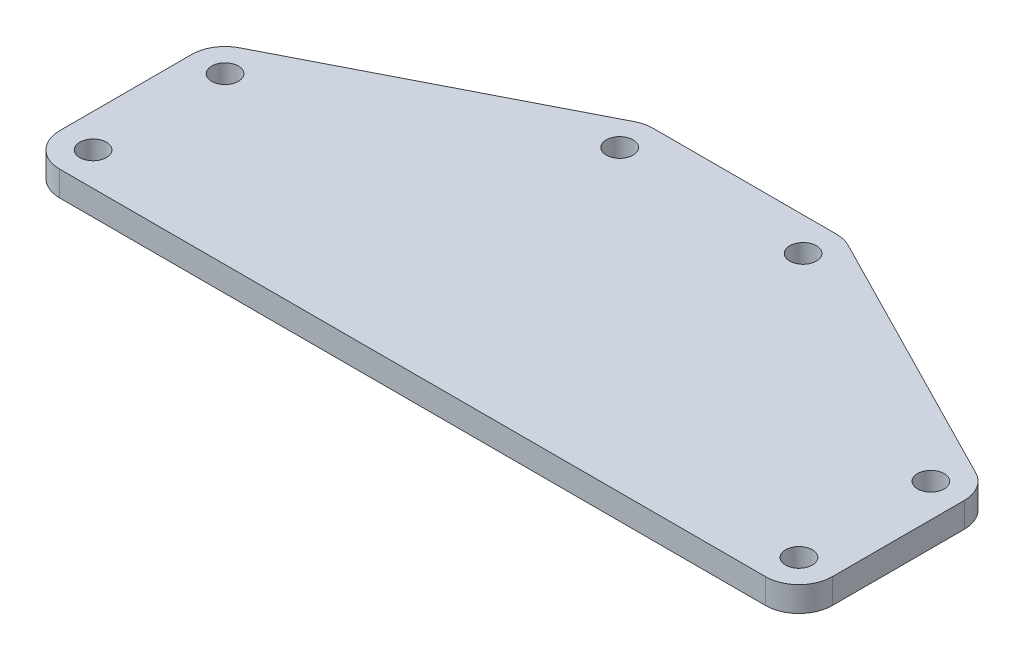
ISO-10303-21;
HEADER;
FILE_DESCRIPTION(('STEP AP214'),'2;1');
FILE_NAME('part.step','',(''),(''),'','','');
FILE_SCHEMA(('AUTOMOTIVE_DESIGN { 1 0 10303 214 1 1 1 1 }'));
ENDSEC;
DATA;
#1=APPLICATION_CONTEXT('core data for automotive mechanical design processes');
#2=APPLICATION_PROTOCOL_DEFINITION('international standard','automotive_design',2000,#1);
#3=PRODUCT_CONTEXT('',#1,'mechanical');
#4=PRODUCT('Part','Part','',(#3));
#5=PRODUCT_RELATED_PRODUCT_CATEGORY('part','',(#4));
#6=PRODUCT_DEFINITION_FORMATION('','',#4);
#7=PRODUCT_DEFINITION_CONTEXT('part definition',#1,'design');
#8=PRODUCT_DEFINITION('design','',#6,#7);
#9=PRODUCT_DEFINITION_SHAPE('','',#8);
#10=(LENGTH_UNIT() NAMED_UNIT(*) SI_UNIT(.MILLI.,.METRE.));
#11=(NAMED_UNIT(*) PLANE_ANGLE_UNIT() SI_UNIT($,.RADIAN.));
#12=(NAMED_UNIT(*) SI_UNIT($,.STERADIAN.) SOLID_ANGLE_UNIT());
#13=UNCERTAINTY_MEASURE_WITH_UNIT(LENGTH_MEASURE(1.E-05),#10,'distance_accuracy_value','');
#14=(GEOMETRIC_REPRESENTATION_CONTEXT(3) GLOBAL_UNCERTAINTY_ASSIGNED_CONTEXT((#13)) GLOBAL_UNIT_ASSIGNED_CONTEXT((#10,
#11,#12)) REPRESENTATION_CONTEXT('',''));
#15=CARTESIAN_POINT('',(0.,0.,0.));
#16=DIRECTION('',(0.,0.,1.));
#17=DIRECTION('',(1.,0.,0.));
#18=AXIS2_PLACEMENT_3D('',#15,#16,#17);
#19=CARTESIAN_POINT('',(-11.,3.,0.));
#20=DIRECTION('',(0.,1.,0.));
#21=DIRECTION('',(0.,0.,1.));
#22=AXIS2_PLACEMENT_3D('',#19,#20,#21);
#23=PLANE('',#22);
#24=CARTESIAN_POINT('',(-11.,3.,0.));
#25=DIRECTION('',(0.,1.,0.));
#26=DIRECTION('',(0.,0.,1.));
#27=AXIS2_PLACEMENT_3D('',#24,#25,#26);
#28=CIRCLE('',#27,1.6);
#29=CARTESIAN_POINT('',(-11.,3.,1.6));
#30=VERTEX_POINT('',#29);
#31=EDGE_CURVE('E468',#30,#30,#28,.T.);
#32=ORIENTED_EDGE('',*,*,#31,.F.);
#33=EDGE_LOOP('',(#32));
#34=FACE_BOUND('',#33,.T.);
#35=CARTESIAN_POINT('',(42.325,3.,31.8249898165467));
#36=DIRECTION('',(0.,1.,0.));
#37=DIRECTION('',(0.,0.,-1.));
#38=AXIS2_PLACEMENT_3D('',#35,#36,#37);
#39=CIRCLE('',#38,1.60000000000001);
#40=CARTESIAN_POINT('',(42.325,3.,30.2249898165467));
#41=VERTEX_POINT('',#40);
#42=EDGE_CURVE('E479',#41,#41,#39,.T.);
#43=ORIENTED_EDGE('',*,*,#42,.F.);
#44=EDGE_LOOP('',(#43));
#45=FACE_BOUND('',#44,.T.);
#46=CARTESIAN_POINT('',(-42.325,3.,31.8249898165467));
#47=DIRECTION('',(0.,1.,0.));
#48=DIRECTION('',(0.,0.,1.));
#49=AXIS2_PLACEMENT_3D('',#46,#47,#48);
#50=CIRCLE('',#49,1.60000000000001);
#51=CARTESIAN_POINT('',(-42.325,3.,33.4249898165467));
#52=VERTEX_POINT('',#51);
#53=EDGE_CURVE('E173',#52,#52,#50,.T.);
#54=ORIENTED_EDGE('',*,*,#53,.F.);
#55=EDGE_LOOP('',(#54));
#56=FACE_BOUND('',#55,.T.);
#57=CARTESIAN_POINT('',(-11.,3.,0.));
#58=DIRECTION('',(0.,1.,0.));
#59=DIRECTION('',(0.,0.,1.));
#60=AXIS2_PLACEMENT_3D('',#57,#58,#59);
#61=CIRCLE('',#60,4.);
#62=CARTESIAN_POINT('',(-11.,3.,-4.));
#63=VERTEX_POINT('',#62);
#64=CARTESIAN_POINT('',(-12.8194915219086,3.,-3.56222551247149));
#65=VERTEX_POINT('',#64);
#66=EDGE_CURVE('E193',#63,#65,#61,.T.);
#67=ORIENTED_EDGE('',*,*,#66,.T.);
#68=DIRECTION('',(-0.890556378117872,0.,0.454872880477149));
#69=VECTOR('',#68,1.);
#70=CARTESIAN_POINT('',(-44.1444915219086,3.,12.4377643040752));
#71=LINE('',#70,#69);
#72=CARTESIAN_POINT('',(-44.1444915219086,3.,12.4377643040752));
#73=VERTEX_POINT('',#72);
#74=EDGE_CURVE('E120',#65,#73,#71,.T.);
#75=ORIENTED_EDGE('',*,*,#74,.T.);
#76=CARTESIAN_POINT('',(-42.325,3.,15.9999898165467));
#77=DIRECTION('',(0.,1.,0.));
#78=DIRECTION('',(0.,0.,1.));
#79=AXIS2_PLACEMENT_3D('',#76,#77,#78);
#80=CIRCLE('',#79,4.);
#81=CARTESIAN_POINT('',(-46.325,3.,15.9999898165467));
#82=VERTEX_POINT('',#81);
#83=EDGE_CURVE('E220',#73,#82,#80,.T.);
#84=ORIENTED_EDGE('',*,*,#83,.T.);
#85=DIRECTION('',(0.,0.,1.));
#86=VECTOR('',#85,1.);
#87=CARTESIAN_POINT('',(-46.325,3.,31.8249898165467));
#88=LINE('',#87,#86);
#89=CARTESIAN_POINT('',(-46.325,3.,31.8249898165467));
#90=VERTEX_POINT('',#89);
#91=EDGE_CURVE('E239',#82,#90,#88,.T.);
#92=ORIENTED_EDGE('',*,*,#91,.T.);
#93=CARTESIAN_POINT('',(-42.325,3.,31.8249898165467));
#94=DIRECTION('',(0.,1.,0.));
#95=DIRECTION('',(0.,0.,1.));
#96=AXIS2_PLACEMENT_3D('',#93,#94,#95);
#97=CIRCLE('',#96,4.);
#98=CARTESIAN_POINT('',(-42.325,3.,35.8249898165467));
#99=VERTEX_POINT('',#98);
#100=EDGE_CURVE('E236',#90,#99,#97,.T.);
#101=ORIENTED_EDGE('',*,*,#100,.T.);
#102=DIRECTION('',(1.,0.,0.));
#103=VECTOR('',#102,1.);
#104=CARTESIAN_POINT('',(-42.325,3.,35.8249898165467));
#105=LINE('',#104,#103);
#106=CARTESIAN_POINT('',(42.325,3.,35.8249898165467));
#107=VERTEX_POINT('',#106);
#108=EDGE_CURVE('E238',#99,#107,#105,.T.);
#109=ORIENTED_EDGE('',*,*,#108,.T.);
#110=CARTESIAN_POINT('',(42.325,3.,31.8249898165467));
#111=DIRECTION('',(0.,1.,0.));
#112=DIRECTION('',(0.,0.,-1.));
#113=AXIS2_PLACEMENT_3D('',#110,#111,#112);
#114=CIRCLE('',#113,4.);
#115=CARTESIAN_POINT('',(46.325,3.,31.8249898165467));
#116=VERTEX_POINT('',#115);
#117=EDGE_CURVE('E241',#107,#116,#114,.T.);
#118=ORIENTED_EDGE('',*,*,#117,.T.);
#119=DIRECTION('',(0.,0.,-1.));
#120=VECTOR('',#119,1.);
#121=CARTESIAN_POINT('',(46.325,3.,31.8249898165467));
#122=LINE('',#121,#120);
#123=CARTESIAN_POINT('',(46.325,3.,15.9999898165467));
#124=VERTEX_POINT('',#123);
#125=EDGE_CURVE('E490',#116,#124,#122,.T.);
#126=ORIENTED_EDGE('',*,*,#125,.T.);
#127=CARTESIAN_POINT('',(42.325,3.,15.9999898165467));
#128=DIRECTION('',(0.,1.,0.));
#129=DIRECTION('',(0.,0.,-1.));
#130=AXIS2_PLACEMENT_3D('',#127,#128,#129);
#131=CIRCLE('',#130,4.);
#132=CARTESIAN_POINT('',(44.1444915219086,3.,12.4377643040752));
#133=VERTEX_POINT('',#132);
#134=EDGE_CURVE('E151',#124,#133,#131,.T.);
#135=ORIENTED_EDGE('',*,*,#134,.T.);
#136=DIRECTION('',(-0.890556378117872,0.,-0.454872880477149));
#137=VECTOR('',#136,1.);
#138=CARTESIAN_POINT('',(44.1444915219086,3.,12.4377643040752));
#139=LINE('',#138,#137);
#140=CARTESIAN_POINT('',(12.8194915219086,3.,-3.56222551247149));
#141=VERTEX_POINT('',#140);
#142=EDGE_CURVE('E145',#133,#141,#139,.T.);
#143=ORIENTED_EDGE('',*,*,#142,.T.);
#144=CARTESIAN_POINT('',(11.,3.,0.));
#145=DIRECTION('',(0.,1.,0.));
#146=DIRECTION('',(0.,0.,-1.));
#147=AXIS2_PLACEMENT_3D('',#144,#145,#146);
#148=CIRCLE('',#147,4.);
#149=CARTESIAN_POINT('',(11.,3.,-4.));
#150=VERTEX_POINT('',#149);
#151=EDGE_CURVE('E149',#141,#150,#148,.T.);
#152=ORIENTED_EDGE('',*,*,#151,.T.);
#153=DIRECTION('',(-1.,0.,0.));
#154=VECTOR('',#153,1.);
#155=CARTESIAN_POINT('',(-11.,3.,-4.));
#156=LINE('',#155,#154);
#157=EDGE_CURVE('E65',#150,#63,#156,.T.);
#158=ORIENTED_EDGE('',*,*,#157,.T.);
#159=EDGE_LOOP('',(#67,#75,#84,#92,#101,#109,#118,#126,#135,#143,#152,#158));
#160=FACE_BOUND('',#159,.T.);
#161=CARTESIAN_POINT('',(-42.325,3.,15.9999898165467));
#162=DIRECTION('',(0.,1.,0.));
#163=DIRECTION('',(0.,0.,1.));
#164=AXIS2_PLACEMENT_3D('',#161,#162,#163);
#165=CIRCLE('',#164,1.6);
#166=CARTESIAN_POINT('',(-42.325,3.,17.5999898165467));
#167=VERTEX_POINT('',#166);
#168=EDGE_CURVE('E263',#167,#167,#165,.T.);
#169=ORIENTED_EDGE('',*,*,#168,.F.);
#170=EDGE_LOOP('',(#169));
#171=FACE_BOUND('',#170,.T.);
#172=CARTESIAN_POINT('',(42.325,3.,15.9999898165467));
#173=DIRECTION('',(0.,1.,0.));
#174=DIRECTION('',(0.,0.,-1.));
#175=AXIS2_PLACEMENT_3D('',#172,#173,#174);
#176=CIRCLE('',#175,1.6);
#177=CARTESIAN_POINT('',(42.325,3.,14.3999898165467));
#178=VERTEX_POINT('',#177);
#179=EDGE_CURVE('E474',#178,#178,#176,.T.);
#180=ORIENTED_EDGE('',*,*,#179,.F.);
#181=EDGE_LOOP('',(#180));
#182=FACE_BOUND('',#181,.T.);
#183=CARTESIAN_POINT('',(11.,3.,0.));
#184=DIRECTION('',(0.,1.,0.));
#185=DIRECTION('',(0.,0.,1.));
#186=AXIS2_PLACEMENT_3D('',#183,#184,#185);
#187=CIRCLE('',#186,1.6);
#188=CARTESIAN_POINT('',(11.,3.,1.6));
#189=VERTEX_POINT('',#188);
#190=EDGE_CURVE('E459',#189,#189,#187,.T.);
#191=ORIENTED_EDGE('',*,*,#190,.F.);
#192=EDGE_LOOP('',(#191));
#193=FACE_BOUND('',#192,.T.);
#194=ADVANCED_FACE('F48',(#34,#45,#56,#160,#171,#182,#193),#23,.T.);
#195=CARTESIAN_POINT('',(-11.,0.,0.));
#196=DIRECTION('',(0.,1.,0.));
#197=DIRECTION('',(0.,0.,1.));
#198=AXIS2_PLACEMENT_3D('',#195,#196,#197);
#199=PLANE('',#198);
#200=CARTESIAN_POINT('',(-11.,0.,0.));
#201=DIRECTION('',(0.,1.,0.));
#202=DIRECTION('',(0.,0.,1.));
#203=AXIS2_PLACEMENT_3D('',#200,#201,#202);
#204=CIRCLE('',#203,4.);
#205=CARTESIAN_POINT('',(-11.,0.,-4.));
#206=VERTEX_POINT('',#205);
#207=CARTESIAN_POINT('',(-12.8194915219086,0.,-3.56222551247149));
#208=VERTEX_POINT('',#207);
#209=EDGE_CURVE('E169',#206,#208,#204,.T.);
#210=ORIENTED_EDGE('',*,*,#209,.F.);
#211=DIRECTION('',(-1.,0.,0.));
#212=VECTOR('',#211,1.);
#213=CARTESIAN_POINT('',(-11.,0.,-4.));
#214=LINE('',#213,#212);
#215=CARTESIAN_POINT('',(11.,0.,-4.));
#216=VERTEX_POINT('',#215);
#217=EDGE_CURVE('E112',#216,#206,#214,.T.);
#218=ORIENTED_EDGE('',*,*,#217,.F.);
#219=CARTESIAN_POINT('',(11.,0.,0.));
#220=DIRECTION('',(0.,1.,0.));
#221=DIRECTION('',(0.,0.,-1.));
#222=AXIS2_PLACEMENT_3D('',#219,#220,#221);
#223=CIRCLE('',#222,4.);
#224=CARTESIAN_POINT('',(12.8194915219086,0.,-3.56222551247149));
#225=VERTEX_POINT('',#224);
#226=EDGE_CURVE('E106',#225,#216,#223,.T.);
#227=ORIENTED_EDGE('',*,*,#226,.F.);
#228=DIRECTION('',(-0.890556378117872,0.,-0.454872880477149));
#229=VECTOR('',#228,1.);
#230=CARTESIAN_POINT('',(44.1444915219086,0.,12.4377643040752));
#231=LINE('',#230,#229);
#232=CARTESIAN_POINT('',(44.1444915219086,0.,12.4377643040752));
#233=VERTEX_POINT('',#232);
#234=EDGE_CURVE('E159',#233,#225,#231,.T.);
#235=ORIENTED_EDGE('',*,*,#234,.F.);
#236=CARTESIAN_POINT('',(42.325,0.,15.9999898165467));
#237=DIRECTION('',(0.,1.,0.));
#238=DIRECTION('',(0.,0.,-1.));
#239=AXIS2_PLACEMENT_3D('',#236,#237,#238);
#240=CIRCLE('',#239,4.);
#241=CARTESIAN_POINT('',(46.325,0.,15.9999898165467));
#242=VERTEX_POINT('',#241);
#243=EDGE_CURVE('E188',#242,#233,#240,.T.);
#244=ORIENTED_EDGE('',*,*,#243,.F.);
#245=DIRECTION('',(0.,0.,-1.));
#246=VECTOR('',#245,1.);
#247=CARTESIAN_POINT('',(46.325,0.,31.8249898165467));
#248=LINE('',#247,#246);
#249=CARTESIAN_POINT('',(46.325,0.,31.8249898165467));
#250=VERTEX_POINT('',#249);
#251=EDGE_CURVE('E186',#250,#242,#248,.T.);
#252=ORIENTED_EDGE('',*,*,#251,.F.);
#253=CARTESIAN_POINT('',(42.325,0.,31.8249898165467));
#254=DIRECTION('',(0.,1.,0.));
#255=DIRECTION('',(0.,0.,-1.));
#256=AXIS2_PLACEMENT_3D('',#253,#254,#255);
#257=CIRCLE('',#256,4.);
#258=CARTESIAN_POINT('',(42.325,0.,35.8249898165467));
#259=VERTEX_POINT('',#258);
#260=EDGE_CURVE('E184',#259,#250,#257,.T.);
#261=ORIENTED_EDGE('',*,*,#260,.F.);
#262=DIRECTION('',(1.,0.,0.));
#263=VECTOR('',#262,1.);
#264=CARTESIAN_POINT('',(-42.325,0.,35.8249898165467));
#265=LINE('',#264,#263);
#266=CARTESIAN_POINT('',(-42.325,0.,35.8249898165467));
#267=VERTEX_POINT('',#266);
#268=EDGE_CURVE('E181',#267,#259,#265,.T.);
#269=ORIENTED_EDGE('',*,*,#268,.F.);
#270=CARTESIAN_POINT('',(-42.325,0.,31.8249898165467));
#271=DIRECTION('',(0.,1.,0.));
#272=DIRECTION('',(0.,0.,1.));
#273=AXIS2_PLACEMENT_3D('',#270,#271,#272);
#274=CIRCLE('',#273,4.);
#275=CARTESIAN_POINT('',(-46.325,0.,31.8249898165467));
#276=VERTEX_POINT('',#275);
#277=EDGE_CURVE('E179',#276,#267,#274,.T.);
#278=ORIENTED_EDGE('',*,*,#277,.F.);
#279=DIRECTION('',(0.,0.,1.));
#280=VECTOR('',#279,1.);
#281=CARTESIAN_POINT('',(-46.325,0.,31.8249898165467));
#282=LINE('',#281,#280);
#283=CARTESIAN_POINT('',(-46.325,0.,15.9999898165467));
#284=VERTEX_POINT('',#283);
#285=EDGE_CURVE('E177',#284,#276,#282,.T.);
#286=ORIENTED_EDGE('',*,*,#285,.F.);
#287=CARTESIAN_POINT('',(-42.325,0.,15.9999898165467));
#288=DIRECTION('',(0.,1.,0.));
#289=DIRECTION('',(0.,0.,1.));
#290=AXIS2_PLACEMENT_3D('',#287,#288,#289);
#291=CIRCLE('',#290,4.);
#292=CARTESIAN_POINT('',(-44.1444915219086,0.,12.4377643040752));
#293=VERTEX_POINT('',#292);
#294=EDGE_CURVE('E175',#293,#284,#291,.T.);
#295=ORIENTED_EDGE('',*,*,#294,.F.);
#296=DIRECTION('',(-0.890556378117872,0.,0.454872880477149));
#297=VECTOR('',#296,1.);
#298=CARTESIAN_POINT('',(-44.1444915219086,0.,12.4377643040752));
#299=LINE('',#298,#297);
#300=EDGE_CURVE('E172',#208,#293,#299,.T.);
#301=ORIENTED_EDGE('',*,*,#300,.F.);
#302=EDGE_LOOP('',(#210,#218,#227,#235,#244,#252,#261,#269,#278,#286,#295,#301));
#303=FACE_BOUND('',#302,.T.);
#304=CARTESIAN_POINT('',(-42.325,0.,31.8249898165467));
#305=DIRECTION('',(0.,1.,0.));
#306=DIRECTION('',(0.,0.,1.));
#307=AXIS2_PLACEMENT_3D('',#304,#305,#306);
#308=CIRCLE('',#307,1.60000000000001);
#309=CARTESIAN_POINT('',(-42.325,0.,33.4249898165467));
#310=VERTEX_POINT('',#309);
#311=EDGE_CURVE('E258',#310,#310,#308,.T.);
#312=ORIENTED_EDGE('',*,*,#311,.T.);
#313=EDGE_LOOP('',(#312));
#314=FACE_BOUND('',#313,.T.);
#315=CARTESIAN_POINT('',(-42.325,0.,15.9999898165467));
#316=DIRECTION('',(0.,1.,0.));
#317=DIRECTION('',(0.,0.,1.));
#318=AXIS2_PLACEMENT_3D('',#315,#316,#317);
#319=CIRCLE('',#318,1.6);
#320=CARTESIAN_POINT('',(-42.325,0.,17.5999898165467));
#321=VERTEX_POINT('',#320);
#322=EDGE_CURVE('E259',#321,#321,#319,.T.);
#323=ORIENTED_EDGE('',*,*,#322,.T.);
#324=EDGE_LOOP('',(#323));
#325=FACE_BOUND('',#324,.T.);
#326=CARTESIAN_POINT('',(42.325,0.,31.8249898165467));
#327=DIRECTION('',(0.,1.,0.));
#328=DIRECTION('',(0.,0.,-1.));
#329=AXIS2_PLACEMENT_3D('',#326,#327,#328);
#330=CIRCLE('',#329,1.60000000000001);
#331=CARTESIAN_POINT('',(42.325,0.,30.2249898165467));
#332=VERTEX_POINT('',#331);
#333=EDGE_CURVE('E477',#332,#332,#330,.T.);
#334=ORIENTED_EDGE('',*,*,#333,.T.);
#335=EDGE_LOOP('',(#334));
#336=FACE_BOUND('',#335,.T.);
#337=CARTESIAN_POINT('',(42.325,0.,15.9999898165467));
#338=DIRECTION('',(0.,1.,0.));
#339=DIRECTION('',(0.,0.,-1.));
#340=AXIS2_PLACEMENT_3D('',#337,#338,#339);
#341=CIRCLE('',#340,1.6);
#342=CARTESIAN_POINT('',(42.325,0.,14.3999898165467));
#343=VERTEX_POINT('',#342);
#344=EDGE_CURVE('E470',#343,#343,#341,.T.);
#345=ORIENTED_EDGE('',*,*,#344,.T.);
#346=EDGE_LOOP('',(#345));
#347=FACE_BOUND('',#346,.T.);
#348=CARTESIAN_POINT('',(-11.,0.,0.));
#349=DIRECTION('',(0.,1.,0.));
#350=DIRECTION('',(0.,0.,1.));
#351=AXIS2_PLACEMENT_3D('',#348,#349,#350);
#352=CIRCLE('',#351,1.6);
#353=CARTESIAN_POINT('',(-11.,0.,1.6));
#354=VERTEX_POINT('',#353);
#355=EDGE_CURVE('E465',#354,#354,#352,.T.);
#356=ORIENTED_EDGE('',*,*,#355,.T.);
#357=EDGE_LOOP('',(#356));
#358=FACE_BOUND('',#357,.T.);
#359=CARTESIAN_POINT('',(11.,0.,0.));
#360=DIRECTION('',(0.,1.,0.));
#361=DIRECTION('',(0.,0.,1.));
#362=AXIS2_PLACEMENT_3D('',#359,#360,#361);
#363=CIRCLE('',#362,1.6);
#364=CARTESIAN_POINT('',(11.,0.,1.6));
#365=VERTEX_POINT('',#364);
#366=EDGE_CURVE('E462',#365,#365,#363,.T.);
#367=ORIENTED_EDGE('',*,*,#366,.T.);
#368=EDGE_LOOP('',(#367));
#369=FACE_BOUND('',#368,.T.);
#370=ADVANCED_FACE('F224',(#303,#314,#325,#336,#347,#358,#369),#199,.F.);
#371=CARTESIAN_POINT('',(-11.,3.,0.));
#372=DIRECTION('',(0.,-1.,0.));
#373=DIRECTION('',(0.,0.,-1.));
#374=AXIS2_PLACEMENT_3D('',#371,#372,#373);
#375=CYLINDRICAL_SURFACE('',#374,4.);
#376=ORIENTED_EDGE('',*,*,#209,.T.);
#377=DIRECTION('',(0.,-1.,0.));
#378=VECTOR('',#377,1.);
#379=CARTESIAN_POINT('',(-12.8194915219086,3.,-3.56222551247149));
#380=LINE('',#379,#378);
#381=EDGE_CURVE('E12',#65,#208,#380,.T.);
#382=ORIENTED_EDGE('',*,*,#381,.F.);
#383=ORIENTED_EDGE('',*,*,#66,.F.);
#384=DIRECTION('',(0.,-1.,0.));
#385=VECTOR('',#384,1.);
#386=CARTESIAN_POINT('',(-11.,3.,-4.));
#387=LINE('',#386,#385);
#388=EDGE_CURVE('E165',#63,#206,#387,.T.);
#389=ORIENTED_EDGE('',*,*,#388,.T.);
#390=EDGE_LOOP('',(#376,#382,#383,#389));
#391=FACE_BOUND('',#390,.T.);
#392=ADVANCED_FACE('F50',(#391),#375,.T.);
#393=CARTESIAN_POINT('',(-44.1444915219086,3.,12.4377643040752));
#394=DIRECTION('',(0.454872880477149,0.,0.890556378117872));
#395=DIRECTION('',(0.890556378117872,0.,-0.454872880477149));
#396=AXIS2_PLACEMENT_3D('',#393,#394,#395);
#397=PLANE('',#396);
#398=ORIENTED_EDGE('',*,*,#300,.T.);
#399=DIRECTION('',(0.,-1.,0.));
#400=VECTOR('',#399,1.);
#401=CARTESIAN_POINT('',(-44.1444915219086,3.,12.4377643040752));
#402=LINE('',#401,#400);
#403=EDGE_CURVE('E57',#73,#293,#402,.T.);
#404=ORIENTED_EDGE('',*,*,#403,.F.);
#405=ORIENTED_EDGE('',*,*,#74,.F.);
#406=ORIENTED_EDGE('',*,*,#381,.T.);
#407=EDGE_LOOP('',(#398,#404,#405,#406));
#408=FACE_BOUND('',#407,.T.);
#409=ADVANCED_FACE('F269',(#408),#397,.F.);
#410=CARTESIAN_POINT('',(-42.325,3.,15.9999898165467));
#411=DIRECTION('',(0.,-1.,0.));
#412=DIRECTION('',(0.,0.,-1.));
#413=AXIS2_PLACEMENT_3D('',#410,#411,#412);
#414=CYLINDRICAL_SURFACE('',#413,4.);
#415=ORIENTED_EDGE('',*,*,#294,.T.);
#416=DIRECTION('',(0.,-1.,0.));
#417=VECTOR('',#416,1.);
#418=CARTESIAN_POINT('',(-46.325,3.,15.9999898165467));
#419=LINE('',#418,#417);
#420=EDGE_CURVE('E212',#82,#284,#419,.T.);
#421=ORIENTED_EDGE('',*,*,#420,.F.);
#422=ORIENTED_EDGE('',*,*,#83,.F.);
#423=ORIENTED_EDGE('',*,*,#403,.T.);
#424=EDGE_LOOP('',(#415,#421,#422,#423));
#425=FACE_BOUND('',#424,.T.);
#426=ADVANCED_FACE('F218',(#425),#414,.T.);
#427=CARTESIAN_POINT('',(-46.325,3.,31.8249898165467));
#428=DIRECTION('',(1.,0.,0.));
#429=DIRECTION('',(0.,0.,-1.));
#430=AXIS2_PLACEMENT_3D('',#427,#428,#429);
#431=PLANE('',#430);
#432=ORIENTED_EDGE('',*,*,#285,.T.);
#433=DIRECTION('',(0.,-1.,0.));
#434=VECTOR('',#433,1.);
#435=CARTESIAN_POINT('',(-46.325,3.,31.8249898165467));
#436=LINE('',#435,#434);
#437=EDGE_CURVE('E209',#90,#276,#436,.T.);
#438=ORIENTED_EDGE('',*,*,#437,.F.);
#439=ORIENTED_EDGE('',*,*,#91,.F.);
#440=ORIENTED_EDGE('',*,*,#420,.T.);
#441=EDGE_LOOP('',(#432,#438,#439,#440));
#442=FACE_BOUND('',#441,.T.);
#443=ADVANCED_FACE('F230',(#442),#431,.F.);
#444=CARTESIAN_POINT('',(-42.325,3.,31.8249898165467));
#445=DIRECTION('',(0.,-1.,0.));
#446=DIRECTION('',(0.,0.,-1.));
#447=AXIS2_PLACEMENT_3D('',#444,#445,#446);
#448=CYLINDRICAL_SURFACE('',#447,4.);
#449=ORIENTED_EDGE('',*,*,#277,.T.);
#450=DIRECTION('',(0.,-1.,0.));
#451=VECTOR('',#450,1.);
#452=CARTESIAN_POINT('',(-42.325,3.,35.8249898165467));
#453=LINE('',#452,#451);
#454=EDGE_CURVE('E206',#99,#267,#453,.T.);
#455=ORIENTED_EDGE('',*,*,#454,.F.);
#456=ORIENTED_EDGE('',*,*,#100,.F.);
#457=ORIENTED_EDGE('',*,*,#437,.T.);
#458=EDGE_LOOP('',(#449,#455,#456,#457));
#459=FACE_BOUND('',#458,.T.);
#460=ADVANCED_FACE('F234',(#459),#448,.T.);
#461=CARTESIAN_POINT('',(-42.325,3.,35.8249898165467));
#462=DIRECTION('',(0.,0.,-1.));
#463=DIRECTION('',(-1.,0.,0.));
#464=AXIS2_PLACEMENT_3D('',#461,#462,#463);
#465=PLANE('',#464);
#466=ORIENTED_EDGE('',*,*,#268,.T.);
#467=DIRECTION('',(0.,-1.,0.));
#468=VECTOR('',#467,1.);
#469=CARTESIAN_POINT('',(42.325,3.,35.8249898165467));
#470=LINE('',#469,#468);
#471=EDGE_CURVE('E203',#107,#259,#470,.T.);
#472=ORIENTED_EDGE('',*,*,#471,.F.);
#473=ORIENTED_EDGE('',*,*,#108,.F.);
#474=ORIENTED_EDGE('',*,*,#454,.T.);
#475=EDGE_LOOP('',(#466,#472,#473,#474));
#476=FACE_BOUND('',#475,.T.);
#477=ADVANCED_FACE('F308',(#476),#465,.F.);
#478=CARTESIAN_POINT('',(42.325,3.,31.8249898165467));
#479=DIRECTION('',(0.,-1.,0.));
#480=DIRECTION('',(0.,0.,-1.));
#481=AXIS2_PLACEMENT_3D('',#478,#479,#480);
#482=CYLINDRICAL_SURFACE('',#481,4.);
#483=ORIENTED_EDGE('',*,*,#260,.T.);
#484=DIRECTION('',(0.,-1.,0.));
#485=VECTOR('',#484,1.);
#486=CARTESIAN_POINT('',(46.325,3.,31.8249898165467));
#487=LINE('',#486,#485);
#488=EDGE_CURVE('E200',#116,#250,#487,.T.);
#489=ORIENTED_EDGE('',*,*,#488,.F.);
#490=ORIENTED_EDGE('',*,*,#117,.F.);
#491=ORIENTED_EDGE('',*,*,#471,.T.);
#492=EDGE_LOOP('',(#483,#489,#490,#491));
#493=FACE_BOUND('',#492,.T.);
#494=ADVANCED_FACE('F304',(#493),#482,.T.);
#495=CARTESIAN_POINT('',(46.325,3.,31.8249898165467));
#496=DIRECTION('',(-1.,0.,0.));
#497=DIRECTION('',(0.,0.,1.));
#498=AXIS2_PLACEMENT_3D('',#495,#496,#497);
#499=PLANE('',#498);
#500=ORIENTED_EDGE('',*,*,#251,.T.);
#501=DIRECTION('',(0.,-1.,0.));
#502=VECTOR('',#501,1.);
#503=CARTESIAN_POINT('',(46.325,3.,15.9999898165467));
#504=LINE('',#503,#502);
#505=EDGE_CURVE('E197',#124,#242,#504,.T.);
#506=ORIENTED_EDGE('',*,*,#505,.F.);
#507=ORIENTED_EDGE('',*,*,#125,.F.);
#508=ORIENTED_EDGE('',*,*,#488,.T.);
#509=EDGE_LOOP('',(#500,#506,#507,#508));
#510=FACE_BOUND('',#509,.T.);
#511=ADVANCED_FACE('F300',(#510),#499,.F.);
#512=CARTESIAN_POINT('',(42.325,3.,15.9999898165467));
#513=DIRECTION('',(0.,-1.,0.));
#514=DIRECTION('',(0.,0.,-1.));
#515=AXIS2_PLACEMENT_3D('',#512,#513,#514);
#516=CYLINDRICAL_SURFACE('',#515,4.);
#517=ORIENTED_EDGE('',*,*,#243,.T.);
#518=DIRECTION('',(0.,-1.,0.));
#519=VECTOR('',#518,1.);
#520=CARTESIAN_POINT('',(44.1444915219086,3.,12.4377643040752));
#521=LINE('',#520,#519);
#522=EDGE_CURVE('E160',#133,#233,#521,.T.);
#523=ORIENTED_EDGE('',*,*,#522,.F.);
#524=ORIENTED_EDGE('',*,*,#134,.F.);
#525=ORIENTED_EDGE('',*,*,#505,.T.);
#526=EDGE_LOOP('',(#517,#523,#524,#525));
#527=FACE_BOUND('',#526,.T.);
#528=ADVANCED_FACE('F297',(#527),#516,.T.);
#529=CARTESIAN_POINT('',(44.1444915219086,3.,12.4377643040752));
#530=DIRECTION('',(-0.454872880477149,0.,0.890556378117872));
#531=DIRECTION('',(0.890556378117872,0.,0.454872880477149));
#532=AXIS2_PLACEMENT_3D('',#529,#530,#531);
#533=PLANE('',#532);
#534=ORIENTED_EDGE('',*,*,#234,.T.);
#535=DIRECTION('',(0.,-1.,0.));
#536=VECTOR('',#535,1.);
#537=CARTESIAN_POINT('',(12.8194915219086,3.,-3.56222551247149));
#538=LINE('',#537,#536);
#539=EDGE_CURVE('E156',#141,#225,#538,.T.);
#540=ORIENTED_EDGE('',*,*,#539,.F.);
#541=ORIENTED_EDGE('',*,*,#142,.F.);
#542=ORIENTED_EDGE('',*,*,#522,.T.);
#543=EDGE_LOOP('',(#534,#540,#541,#542));
#544=FACE_BOUND('',#543,.T.);
#545=ADVANCED_FACE('F157',(#544),#533,.F.);
#546=CARTESIAN_POINT('',(11.,3.,0.));
#547=DIRECTION('',(0.,-1.,0.));
#548=DIRECTION('',(0.,0.,-1.));
#549=AXIS2_PLACEMENT_3D('',#546,#547,#548);
#550=CYLINDRICAL_SURFACE('',#549,4.);
#551=ORIENTED_EDGE('',*,*,#226,.T.);
#552=DIRECTION('',(0.,-1.,0.));
#553=VECTOR('',#552,1.);
#554=CARTESIAN_POINT('',(11.,3.,-4.));
#555=LINE('',#554,#553);
#556=EDGE_CURVE('E161',#150,#216,#555,.T.);
#557=ORIENTED_EDGE('',*,*,#556,.F.);
#558=ORIENTED_EDGE('',*,*,#151,.F.);
#559=ORIENTED_EDGE('',*,*,#539,.T.);
#560=EDGE_LOOP('',(#551,#557,#558,#559));
#561=FACE_BOUND('',#560,.T.);
#562=ADVANCED_FACE('F163',(#561),#550,.T.);
#563=CARTESIAN_POINT('',(-11.,3.,-4.));
#564=DIRECTION('',(0.,0.,1.));
#565=DIRECTION('',(1.,0.,0.));
#566=AXIS2_PLACEMENT_3D('',#563,#564,#565);
#567=PLANE('',#566);
#568=ORIENTED_EDGE('',*,*,#217,.T.);
#569=ORIENTED_EDGE('',*,*,#388,.F.);
#570=ORIENTED_EDGE('',*,*,#157,.F.);
#571=ORIENTED_EDGE('',*,*,#556,.T.);
#572=EDGE_LOOP('',(#568,#569,#570,#571));
#573=FACE_BOUND('',#572,.T.);
#574=ADVANCED_FACE('F290',(#573),#567,.F.);
#575=CARTESIAN_POINT('',(-42.325,3.,31.8249898165467));
#576=DIRECTION('',(0.,-1.,0.));
#577=DIRECTION('',(0.,0.,-1.));
#578=AXIS2_PLACEMENT_3D('',#575,#576,#577);
#579=CYLINDRICAL_SURFACE('',#578,1.60000000000001);
#580=ORIENTED_EDGE('',*,*,#53,.T.);
#581=EDGE_LOOP('',(#580));
#582=FACE_BOUND('',#581,.T.);
#583=ORIENTED_EDGE('',*,*,#311,.F.);
#584=EDGE_LOOP('',(#583));
#585=FACE_BOUND('',#584,.T.);
#586=ADVANCED_FACE('F287',(#582,#585),#579,.F.);
#587=CARTESIAN_POINT('',(-42.325,3.,15.9999898165467));
#588=DIRECTION('',(0.,-1.,0.));
#589=DIRECTION('',(0.,0.,-1.));
#590=AXIS2_PLACEMENT_3D('',#587,#588,#589);
#591=CYLINDRICAL_SURFACE('',#590,1.6);
#592=ORIENTED_EDGE('',*,*,#168,.T.);
#593=EDGE_LOOP('',(#592));
#594=FACE_BOUND('',#593,.T.);
#595=ORIENTED_EDGE('',*,*,#322,.F.);
#596=EDGE_LOOP('',(#595));
#597=FACE_BOUND('',#596,.T.);
#598=ADVANCED_FACE('F367',(#594,#597),#591,.F.);
#599=CARTESIAN_POINT('',(42.325,3.,31.8249898165467));
#600=DIRECTION('',(0.,-1.,0.));
#601=DIRECTION('',(0.,0.,-1.));
#602=AXIS2_PLACEMENT_3D('',#599,#600,#601);
#603=CYLINDRICAL_SURFACE('',#602,1.60000000000001);
#604=ORIENTED_EDGE('',*,*,#42,.T.);
#605=EDGE_LOOP('',(#604));
#606=FACE_BOUND('',#605,.T.);
#607=ORIENTED_EDGE('',*,*,#333,.F.);
#608=EDGE_LOOP('',(#607));
#609=FACE_BOUND('',#608,.T.);
#610=ADVANCED_FACE('F375',(#606,#609),#603,.F.);
#611=CARTESIAN_POINT('',(42.325,3.,15.9999898165467));
#612=DIRECTION('',(0.,-1.,0.));
#613=DIRECTION('',(0.,0.,-1.));
#614=AXIS2_PLACEMENT_3D('',#611,#612,#613);
#615=CYLINDRICAL_SURFACE('',#614,1.6);
#616=ORIENTED_EDGE('',*,*,#179,.T.);
#617=EDGE_LOOP('',(#616));
#618=FACE_BOUND('',#617,.T.);
#619=ORIENTED_EDGE('',*,*,#344,.F.);
#620=EDGE_LOOP('',(#619));
#621=FACE_BOUND('',#620,.T.);
#622=ADVANCED_FACE('F383',(#618,#621),#615,.F.);
#623=CARTESIAN_POINT('',(-11.,3.,0.));
#624=DIRECTION('',(0.,-1.,0.));
#625=DIRECTION('',(0.,0.,-1.));
#626=AXIS2_PLACEMENT_3D('',#623,#624,#625);
#627=CYLINDRICAL_SURFACE('',#626,1.6);
#628=ORIENTED_EDGE('',*,*,#31,.T.);
#629=EDGE_LOOP('',(#628));
#630=FACE_BOUND('',#629,.T.);
#631=ORIENTED_EDGE('',*,*,#355,.F.);
#632=EDGE_LOOP('',(#631));
#633=FACE_BOUND('',#632,.T.);
#634=ADVANCED_FACE('F392',(#630,#633),#627,.F.);
#635=CARTESIAN_POINT('',(11.,3.,0.));
#636=DIRECTION('',(0.,-1.,0.));
#637=DIRECTION('',(0.,0.,-1.));
#638=AXIS2_PLACEMENT_3D('',#635,#636,#637);
#639=CYLINDRICAL_SURFACE('',#638,1.6);
#640=ORIENTED_EDGE('',*,*,#190,.T.);
#641=EDGE_LOOP('',(#640));
#642=FACE_BOUND('',#641,.T.);
#643=ORIENTED_EDGE('',*,*,#366,.F.);
#644=EDGE_LOOP('',(#643));
#645=FACE_BOUND('',#644,.T.);
#646=ADVANCED_FACE('F401',(#642,#645),#639,.F.);
#647=CLOSED_SHELL('',(#194,#370,#392,#409,#426,#443,#460,#477,#494,#511,#528,#545,#562,#574,
#586,#598,#610,#622,#634,#646));
#648=MANIFOLD_SOLID_BREP('B2',#647);
#649=ADVANCED_BREP_SHAPE_REPRESENTATION('',(#18,#648),#14);
#650=SHAPE_DEFINITION_REPRESENTATION(#9,#649);
ENDSEC;
END-ISO-10303-21;
